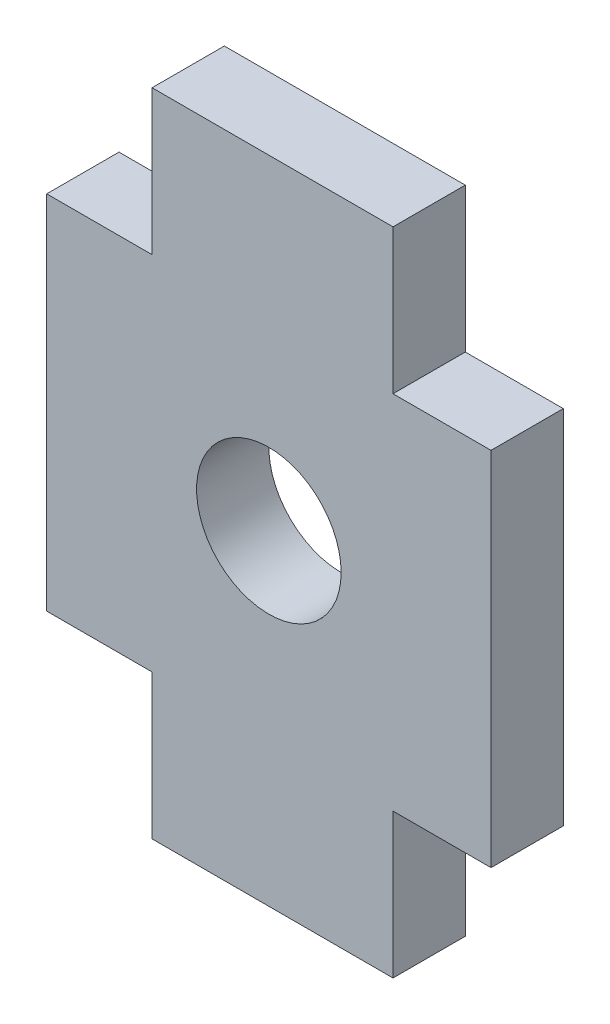
ISO-10303-21;
HEADER;
FILE_DESCRIPTION(('STEP AP214'),'2;1');
FILE_NAME('part.step','',(''),(''),'','','');
FILE_SCHEMA(('AUTOMOTIVE_DESIGN { 1 0 10303 214 1 1 1 1 }'));
ENDSEC;
DATA;
#1=APPLICATION_CONTEXT('core data for automotive mechanical design processes');
#2=APPLICATION_PROTOCOL_DEFINITION('international standard','automotive_design',2000,#1);
#3=PRODUCT_CONTEXT('',#1,'mechanical');
#4=PRODUCT('Part','Part','',(#3));
#5=PRODUCT_RELATED_PRODUCT_CATEGORY('part','',(#4));
#6=PRODUCT_DEFINITION_FORMATION('','',#4);
#7=PRODUCT_DEFINITION_CONTEXT('part definition',#1,'design');
#8=PRODUCT_DEFINITION('design','',#6,#7);
#9=PRODUCT_DEFINITION_SHAPE('','',#8);
#10=(LENGTH_UNIT() NAMED_UNIT(*) SI_UNIT(.MILLI.,.METRE.));
#11=(NAMED_UNIT(*) PLANE_ANGLE_UNIT() SI_UNIT($,.RADIAN.));
#12=(NAMED_UNIT(*) SI_UNIT($,.STERADIAN.) SOLID_ANGLE_UNIT());
#13=UNCERTAINTY_MEASURE_WITH_UNIT(LENGTH_MEASURE(1.E-05),#10,'distance_accuracy_value','');
#14=(GEOMETRIC_REPRESENTATION_CONTEXT(3) GLOBAL_UNCERTAINTY_ASSIGNED_CONTEXT((#13)) GLOBAL_UNIT_ASSIGNED_CONTEXT((#10,
#11,#12)) REPRESENTATION_CONTEXT('',''));
#15=CARTESIAN_POINT('',(0.,0.,0.));
#16=DIRECTION('',(0.,0.,1.));
#17=DIRECTION('',(1.,0.,0.));
#18=AXIS2_PLACEMENT_3D('',#15,#16,#17);
#19=CARTESIAN_POINT('',(0.,0.,6.));
#20=DIRECTION('',(0.,0.,-1.));
#21=DIRECTION('',(-1.,0.,0.));
#22=AXIS2_PLACEMENT_3D('',#19,#20,#21);
#23=PLANE('',#22);
#24=DIRECTION('',(0.,1.,0.));
#25=VECTOR('',#24,1.);
#26=CARTESIAN_POINT('',(-182.683627049338,-111.762954902338,6.));
#27=LINE('',#26,#25);
#28=CARTESIAN_POINT('',(-182.683627049338,-117.762954902338,6.));
#29=VERTEX_POINT('',#28);
#30=CARTESIAN_POINT('',(-182.683627049338,-105.762954902338,6.));
#31=VERTEX_POINT('',#30);
#32=EDGE_CURVE('E57',#29,#31,#27,.T.);
#33=ORIENTED_EDGE('',*,*,#32,.T.);
#34=DIRECTION('',(1.,0.,0.));
#35=VECTOR('',#34,1.);
#36=CARTESIAN_POINT('',(-182.683627049338,-105.762954902338,6.));
#37=LINE('',#36,#35);
#38=CARTESIAN_POINT('',(-174.549373807979,-105.762954902338,6.));
#39=VERTEX_POINT('',#38);
#40=EDGE_CURVE('E112',#31,#39,#37,.T.);
#41=ORIENTED_EDGE('',*,*,#40,.T.);
#42=DIRECTION('',(0.,1.,0.));
#43=VECTOR('',#42,1.);
#44=CARTESIAN_POINT('',(-174.549373807979,-75.7629549023382,6.));
#45=LINE('',#44,#43);
#46=CARTESIAN_POINT('',(-174.549373807979,-75.7629549023382,6.));
#47=VERTEX_POINT('',#46);
#48=EDGE_CURVE('E241',#39,#47,#45,.T.);
#49=ORIENTED_EDGE('',*,*,#48,.T.);
#50=DIRECTION('',(-1.,0.,0.));
#51=VECTOR('',#50,1.);
#52=CARTESIAN_POINT('',(-182.683627049338,-75.7629549023382,6.));
#53=LINE('',#52,#51);
#54=CARTESIAN_POINT('',(-182.683627049338,-75.7629549023382,6.));
#55=VERTEX_POINT('',#54);
#56=EDGE_CURVE('E261',#47,#55,#53,.T.);
#57=ORIENTED_EDGE('',*,*,#56,.T.);
#58=DIRECTION('',(0.,1.,0.));
#59=VECTOR('',#58,1.);
#60=CARTESIAN_POINT('',(-182.683627049338,-69.7629549023382,6.));
#61=LINE('',#60,#59);
#62=CARTESIAN_POINT('',(-182.683627049338,-63.7629549023382,6.));
#63=VERTEX_POINT('',#62);
#64=EDGE_CURVE('E257',#55,#63,#61,.T.);
#65=ORIENTED_EDGE('',*,*,#64,.T.);
#66=DIRECTION('',(-1.,0.,0.));
#67=VECTOR('',#66,1.);
#68=CARTESIAN_POINT('',(-202.683627049338,-63.7629549023382,6.));
#69=LINE('',#68,#67);
#70=CARTESIAN_POINT('',(-202.683627049338,-63.7629549023382,6.));
#71=VERTEX_POINT('',#70);
#72=EDGE_CURVE('E260',#63,#71,#69,.T.);
#73=ORIENTED_EDGE('',*,*,#72,.T.);
#74=DIRECTION('',(0.,-1.,0.));
#75=VECTOR('',#74,1.);
#76=CARTESIAN_POINT('',(-202.683627049338,-69.7629549023382,6.));
#77=LINE('',#76,#75);
#78=CARTESIAN_POINT('',(-202.683627049338,-75.7629549023382,6.));
#79=VERTEX_POINT('',#78);
#80=EDGE_CURVE('E265',#71,#79,#77,.T.);
#81=ORIENTED_EDGE('',*,*,#80,.T.);
#82=DIRECTION('',(-1.,0.,0.));
#83=VECTOR('',#82,1.);
#84=CARTESIAN_POINT('',(-211.428617247897,-75.7629549023382,6.));
#85=LINE('',#84,#83);
#86=CARTESIAN_POINT('',(-211.428617247897,-75.7629549023382,6.));
#87=VERTEX_POINT('',#86);
#88=EDGE_CURVE('E272',#79,#87,#85,.T.);
#89=ORIENTED_EDGE('',*,*,#88,.T.);
#90=DIRECTION('',(0.,-1.,0.));
#91=VECTOR('',#90,1.);
#92=CARTESIAN_POINT('',(-211.428617247897,-75.7629549023382,6.));
#93=LINE('',#92,#91);
#94=CARTESIAN_POINT('',(-211.428617247897,-105.762954902338,6.));
#95=VERTEX_POINT('',#94);
#96=EDGE_CURVE('E144',#87,#95,#93,.T.);
#97=ORIENTED_EDGE('',*,*,#96,.T.);
#98=DIRECTION('',(1.,0.,0.));
#99=VECTOR('',#98,1.);
#100=CARTESIAN_POINT('',(-211.428617247897,-105.762954902338,6.));
#101=LINE('',#100,#99);
#102=CARTESIAN_POINT('',(-202.683627049338,-105.762954902338,6.));
#103=VERTEX_POINT('',#102);
#104=EDGE_CURVE('E138',#95,#103,#101,.T.);
#105=ORIENTED_EDGE('',*,*,#104,.T.);
#106=DIRECTION('',(0.,-1.,0.));
#107=VECTOR('',#106,1.);
#108=CARTESIAN_POINT('',(-202.683627049338,-111.762954902338,6.));
#109=LINE('',#108,#107);
#110=CARTESIAN_POINT('',(-202.683627049338,-117.762954902338,6.));
#111=VERTEX_POINT('',#110);
#112=EDGE_CURVE('E142',#103,#111,#109,.T.);
#113=ORIENTED_EDGE('',*,*,#112,.T.);
#114=DIRECTION('',(1.,0.,0.));
#115=VECTOR('',#114,1.);
#116=CARTESIAN_POINT('',(-202.683627049338,-117.762954902338,6.));
#117=LINE('',#116,#115);
#118=EDGE_CURVE('E162',#111,#29,#117,.T.);
#119=ORIENTED_EDGE('',*,*,#118,.T.);
#120=EDGE_LOOP('',(#33,#41,#49,#57,#65,#73,#81,#89,#97,#105,#113,#119));
#121=FACE_BOUND('',#120,.T.);
#122=CARTESIAN_POINT('',(-192.988995527938,-90.7629549023382,6.));
#123=DIRECTION('',(0.,0.,1.));
#124=DIRECTION('',(1.,0.,0.));
#125=AXIS2_PLACEMENT_3D('',#122,#123,#124);
#126=CIRCLE('',#125,6.00000000000002);
#127=CARTESIAN_POINT('',(-186.988995527938,-90.7629549023382,6.));
#128=VERTEX_POINT('',#127);
#129=EDGE_CURVE('E173',#128,#128,#126,.T.);
#130=ORIENTED_EDGE('',*,*,#129,.F.);
#131=EDGE_LOOP('',(#130));
#132=FACE_BOUND('',#131,.T.);
#133=ADVANCED_FACE('F39',(#121,#132),#23,.F.);
#134=CARTESIAN_POINT('',(0.,0.,0.));
#135=DIRECTION('',(0.,0.,-1.));
#136=DIRECTION('',(-1.,0.,0.));
#137=AXIS2_PLACEMENT_3D('',#134,#135,#136);
#138=PLANE('',#137);
#139=DIRECTION('',(1.,0.,0.));
#140=VECTOR('',#139,1.);
#141=CARTESIAN_POINT('',(-182.683627049338,-105.762954902338,0.));
#142=LINE('',#141,#140);
#143=CARTESIAN_POINT('',(-182.683627049338,-105.762954902338,0.));
#144=VERTEX_POINT('',#143);
#145=CARTESIAN_POINT('',(-174.549373807979,-105.762954902338,0.));
#146=VERTEX_POINT('',#145);
#147=EDGE_CURVE('E169',#144,#146,#142,.T.);
#148=ORIENTED_EDGE('',*,*,#147,.F.);
#149=DIRECTION('',(0.,1.,0.));
#150=VECTOR('',#149,1.);
#151=CARTESIAN_POINT('',(-182.683627049338,-111.762954902338,0.));
#152=LINE('',#151,#150);
#153=CARTESIAN_POINT('',(-182.683627049338,-117.762954902338,0.));
#154=VERTEX_POINT('',#153);
#155=EDGE_CURVE('E202',#154,#144,#152,.T.);
#156=ORIENTED_EDGE('',*,*,#155,.F.);
#157=DIRECTION('',(1.,0.,0.));
#158=VECTOR('',#157,1.);
#159=CARTESIAN_POINT('',(-202.683627049338,-117.762954902338,0.));
#160=LINE('',#159,#158);
#161=CARTESIAN_POINT('',(-202.683627049338,-117.762954902338,0.));
#162=VERTEX_POINT('',#161);
#163=EDGE_CURVE('E105',#162,#154,#160,.T.);
#164=ORIENTED_EDGE('',*,*,#163,.F.);
#165=DIRECTION('',(0.,-1.,0.));
#166=VECTOR('',#165,1.);
#167=CARTESIAN_POINT('',(-202.683627049338,-111.762954902338,0.));
#168=LINE('',#167,#166);
#169=CARTESIAN_POINT('',(-202.683627049338,-105.762954902338,0.));
#170=VERTEX_POINT('',#169);
#171=EDGE_CURVE('E98',#170,#162,#168,.T.);
#172=ORIENTED_EDGE('',*,*,#171,.F.);
#173=DIRECTION('',(1.,0.,0.));
#174=VECTOR('',#173,1.);
#175=CARTESIAN_POINT('',(-211.428617247897,-105.762954902338,0.));
#176=LINE('',#175,#174);
#177=CARTESIAN_POINT('',(-211.428617247897,-105.762954902338,0.));
#178=VERTEX_POINT('',#177);
#179=EDGE_CURVE('E154',#178,#170,#176,.T.);
#180=ORIENTED_EDGE('',*,*,#179,.F.);
#181=DIRECTION('',(0.,-1.,0.));
#182=VECTOR('',#181,1.);
#183=CARTESIAN_POINT('',(-211.428617247897,-75.7629549023382,0.));
#184=LINE('',#183,#182);
#185=CARTESIAN_POINT('',(-211.428617247897,-75.7629549023382,0.));
#186=VERTEX_POINT('',#185);
#187=EDGE_CURVE('E193',#186,#178,#184,.T.);
#188=ORIENTED_EDGE('',*,*,#187,.F.);
#189=DIRECTION('',(-1.,0.,0.));
#190=VECTOR('',#189,1.);
#191=CARTESIAN_POINT('',(-211.428617247897,-75.7629549023382,0.));
#192=LINE('',#191,#190);
#193=CARTESIAN_POINT('',(-202.683627049338,-75.7629549023382,0.));
#194=VERTEX_POINT('',#193);
#195=EDGE_CURVE('E190',#194,#186,#192,.T.);
#196=ORIENTED_EDGE('',*,*,#195,.F.);
#197=DIRECTION('',(0.,-1.,0.));
#198=VECTOR('',#197,1.);
#199=CARTESIAN_POINT('',(-202.683627049338,-69.7629549023382,0.));
#200=LINE('',#199,#198);
#201=CARTESIAN_POINT('',(-202.683627049338,-63.7629549023382,0.));
#202=VERTEX_POINT('',#201);
#203=EDGE_CURVE('E187',#202,#194,#200,.T.);
#204=ORIENTED_EDGE('',*,*,#203,.F.);
#205=DIRECTION('',(-1.,0.,0.));
#206=VECTOR('',#205,1.);
#207=CARTESIAN_POINT('',(-202.683627049338,-63.7629549023382,0.));
#208=LINE('',#207,#206);
#209=CARTESIAN_POINT('',(-182.683627049338,-63.7629549023382,0.));
#210=VERTEX_POINT('',#209);
#211=EDGE_CURVE('E183',#210,#202,#208,.T.);
#212=ORIENTED_EDGE('',*,*,#211,.F.);
#213=DIRECTION('',(0.,1.,0.));
#214=VECTOR('',#213,1.);
#215=CARTESIAN_POINT('',(-182.683627049338,-69.7629549023382,0.));
#216=LINE('',#215,#214);
#217=CARTESIAN_POINT('',(-182.683627049338,-75.7629549023382,0.));
#218=VERTEX_POINT('',#217);
#219=EDGE_CURVE('E180',#218,#210,#216,.T.);
#220=ORIENTED_EDGE('',*,*,#219,.F.);
#221=DIRECTION('',(-1.,0.,0.));
#222=VECTOR('',#221,1.);
#223=CARTESIAN_POINT('',(-182.683627049338,-75.7629549023382,0.));
#224=LINE('',#223,#222);
#225=CARTESIAN_POINT('',(-174.549373807979,-75.7629549023382,0.));
#226=VERTEX_POINT('',#225);
#227=EDGE_CURVE('E176',#226,#218,#224,.T.);
#228=ORIENTED_EDGE('',*,*,#227,.F.);
#229=DIRECTION('',(0.,1.,0.));
#230=VECTOR('',#229,1.);
#231=CARTESIAN_POINT('',(-174.549373807979,-75.7629549023382,0.));
#232=LINE('',#231,#230);
#233=EDGE_CURVE('E172',#146,#226,#232,.T.);
#234=ORIENTED_EDGE('',*,*,#233,.F.);
#235=EDGE_LOOP('',(#148,#156,#164,#172,#180,#188,#196,#204,#212,#220,#228,#234));
#236=FACE_BOUND('',#235,.T.);
#237=CARTESIAN_POINT('',(-192.988995527938,-90.7629549023382,0.));
#238=DIRECTION('',(0.,0.,1.));
#239=DIRECTION('',(1.,0.,0.));
#240=AXIS2_PLACEMENT_3D('',#237,#238,#239);
#241=CIRCLE('',#240,6.00000000000002);
#242=CARTESIAN_POINT('',(-186.988995527938,-90.7629549023382,0.));
#243=VERTEX_POINT('',#242);
#244=EDGE_CURVE('E292',#243,#243,#241,.T.);
#245=ORIENTED_EDGE('',*,*,#244,.T.);
#246=EDGE_LOOP('',(#245));
#247=FACE_BOUND('',#246,.T.);
#248=ADVANCED_FACE('F245',(#236,#247),#138,.T.);
#249=CARTESIAN_POINT('',(-182.683627049338,-105.762954902338,6.));
#250=DIRECTION('',(0.,1.,0.));
#251=DIRECTION('',(0.,0.,1.));
#252=AXIS2_PLACEMENT_3D('',#249,#250,#251);
#253=PLANE('',#252);
#254=ORIENTED_EDGE('',*,*,#147,.T.);
#255=DIRECTION('',(0.,0.,-1.));
#256=VECTOR('',#255,1.);
#257=CARTESIAN_POINT('',(-174.549373807979,-105.762954902338,6.));
#258=LINE('',#257,#256);
#259=EDGE_CURVE('E49',#39,#146,#258,.T.);
#260=ORIENTED_EDGE('',*,*,#259,.F.);
#261=ORIENTED_EDGE('',*,*,#40,.F.);
#262=DIRECTION('',(0.,0.,-1.));
#263=VECTOR('',#262,1.);
#264=CARTESIAN_POINT('',(-182.683627049338,-105.762954902338,6.));
#265=LINE('',#264,#263);
#266=EDGE_CURVE('E11',#31,#144,#265,.T.);
#267=ORIENTED_EDGE('',*,*,#266,.T.);
#268=EDGE_LOOP('',(#254,#260,#261,#267));
#269=FACE_BOUND('',#268,.T.);
#270=ADVANCED_FACE('F41',(#269),#253,.F.);
#271=CARTESIAN_POINT('',(-174.549373807979,-75.7629549023382,6.));
#272=DIRECTION('',(-1.,0.,0.));
#273=DIRECTION('',(0.,0.,1.));
#274=AXIS2_PLACEMENT_3D('',#271,#272,#273);
#275=PLANE('',#274);
#276=ORIENTED_EDGE('',*,*,#233,.T.);
#277=DIRECTION('',(0.,0.,-1.));
#278=VECTOR('',#277,1.);
#279=CARTESIAN_POINT('',(-174.549373807979,-75.7629549023382,6.));
#280=LINE('',#279,#278);
#281=EDGE_CURVE('E231',#47,#226,#280,.T.);
#282=ORIENTED_EDGE('',*,*,#281,.F.);
#283=ORIENTED_EDGE('',*,*,#48,.F.);
#284=ORIENTED_EDGE('',*,*,#259,.T.);
#285=EDGE_LOOP('',(#276,#282,#283,#284));
#286=FACE_BOUND('',#285,.T.);
#287=ADVANCED_FACE('F239',(#286),#275,.F.);
#288=CARTESIAN_POINT('',(-182.683627049338,-75.7629549023382,6.));
#289=DIRECTION('',(0.,-1.,0.));
#290=DIRECTION('',(0.,0.,-1.));
#291=AXIS2_PLACEMENT_3D('',#288,#289,#290);
#292=PLANE('',#291);
#293=ORIENTED_EDGE('',*,*,#227,.T.);
#294=DIRECTION('',(0.,0.,-1.));
#295=VECTOR('',#294,1.);
#296=CARTESIAN_POINT('',(-182.683627049338,-75.7629549023382,6.));
#297=LINE('',#296,#295);
#298=EDGE_CURVE('E227',#55,#218,#297,.T.);
#299=ORIENTED_EDGE('',*,*,#298,.F.);
#300=ORIENTED_EDGE('',*,*,#56,.F.);
#301=ORIENTED_EDGE('',*,*,#281,.T.);
#302=EDGE_LOOP('',(#293,#299,#300,#301));
#303=FACE_BOUND('',#302,.T.);
#304=ADVANCED_FACE('F251',(#303),#292,.F.);
#305=CARTESIAN_POINT('',(-182.683627049338,-69.7629549023382,6.));
#306=DIRECTION('',(-1.,0.,0.));
#307=DIRECTION('',(0.,0.,1.));
#308=AXIS2_PLACEMENT_3D('',#305,#306,#307);
#309=PLANE('',#308);
#310=ORIENTED_EDGE('',*,*,#219,.T.);
#311=DIRECTION('',(0.,0.,-1.));
#312=VECTOR('',#311,1.);
#313=CARTESIAN_POINT('',(-182.683627049338,-63.7629549023382,6.));
#314=LINE('',#313,#312);
#315=EDGE_CURVE('E223',#63,#210,#314,.T.);
#316=ORIENTED_EDGE('',*,*,#315,.F.);
#317=ORIENTED_EDGE('',*,*,#64,.F.);
#318=ORIENTED_EDGE('',*,*,#298,.T.);
#319=EDGE_LOOP('',(#310,#316,#317,#318));
#320=FACE_BOUND('',#319,.T.);
#321=ADVANCED_FACE('F255',(#320),#309,.F.);
#322=CARTESIAN_POINT('',(-202.683627049338,-63.7629549023382,6.));
#323=DIRECTION('',(0.,-1.,0.));
#324=DIRECTION('',(0.,0.,-1.));
#325=AXIS2_PLACEMENT_3D('',#322,#323,#324);
#326=PLANE('',#325);
#327=ORIENTED_EDGE('',*,*,#211,.T.);
#328=DIRECTION('',(0.,0.,-1.));
#329=VECTOR('',#328,1.);
#330=CARTESIAN_POINT('',(-202.683627049338,-63.7629549023382,6.));
#331=LINE('',#330,#329);
#332=EDGE_CURVE('E219',#71,#202,#331,.T.);
#333=ORIENTED_EDGE('',*,*,#332,.F.);
#334=ORIENTED_EDGE('',*,*,#72,.F.);
#335=ORIENTED_EDGE('',*,*,#315,.T.);
#336=EDGE_LOOP('',(#327,#333,#334,#335));
#337=FACE_BOUND('',#336,.T.);
#338=ADVANCED_FACE('F326',(#337),#326,.F.);
#339=CARTESIAN_POINT('',(-202.683627049338,-69.7629549023382,6.));
#340=DIRECTION('',(1.,0.,0.));
#341=DIRECTION('',(0.,0.,-1.));
#342=AXIS2_PLACEMENT_3D('',#339,#340,#341);
#343=PLANE('',#342);
#344=ORIENTED_EDGE('',*,*,#203,.T.);
#345=DIRECTION('',(0.,0.,-1.));
#346=VECTOR('',#345,1.);
#347=CARTESIAN_POINT('',(-202.683627049338,-75.7629549023382,6.));
#348=LINE('',#347,#346);
#349=EDGE_CURVE('E215',#79,#194,#348,.T.);
#350=ORIENTED_EDGE('',*,*,#349,.F.);
#351=ORIENTED_EDGE('',*,*,#80,.F.);
#352=ORIENTED_EDGE('',*,*,#332,.T.);
#353=EDGE_LOOP('',(#344,#350,#351,#352));
#354=FACE_BOUND('',#353,.T.);
#355=ADVANCED_FACE('F323',(#354),#343,.F.);
#356=CARTESIAN_POINT('',(-211.428617247897,-75.7629549023382,6.));
#357=DIRECTION('',(0.,-1.,0.));
#358=DIRECTION('',(0.,0.,-1.));
#359=AXIS2_PLACEMENT_3D('',#356,#357,#358);
#360=PLANE('',#359);
#361=ORIENTED_EDGE('',*,*,#195,.T.);
#362=DIRECTION('',(0.,0.,-1.));
#363=VECTOR('',#362,1.);
#364=CARTESIAN_POINT('',(-211.428617247897,-75.7629549023382,6.));
#365=LINE('',#364,#363);
#366=EDGE_CURVE('E211',#87,#186,#365,.T.);
#367=ORIENTED_EDGE('',*,*,#366,.F.);
#368=ORIENTED_EDGE('',*,*,#88,.F.);
#369=ORIENTED_EDGE('',*,*,#349,.T.);
#370=EDGE_LOOP('',(#361,#367,#368,#369));
#371=FACE_BOUND('',#370,.T.);
#372=ADVANCED_FACE('F280',(#371),#360,.F.);
#373=CARTESIAN_POINT('',(-211.428617247897,-75.7629549023382,6.));
#374=DIRECTION('',(1.,0.,0.));
#375=DIRECTION('',(0.,0.,-1.));
#376=AXIS2_PLACEMENT_3D('',#373,#374,#375);
#377=PLANE('',#376);
#378=ORIENTED_EDGE('',*,*,#187,.T.);
#379=DIRECTION('',(0.,0.,-1.));
#380=VECTOR('',#379,1.);
#381=CARTESIAN_POINT('',(-211.428617247897,-105.762954902338,6.));
#382=LINE('',#381,#380);
#383=EDGE_CURVE('E156',#95,#178,#382,.T.);
#384=ORIENTED_EDGE('',*,*,#383,.F.);
#385=ORIENTED_EDGE('',*,*,#96,.F.);
#386=ORIENTED_EDGE('',*,*,#366,.T.);
#387=EDGE_LOOP('',(#378,#384,#385,#386));
#388=FACE_BOUND('',#387,.T.);
#389=ADVANCED_FACE('F284',(#388),#377,.F.);
#390=CARTESIAN_POINT('',(-211.428617247897,-105.762954902338,6.));
#391=DIRECTION('',(0.,1.,0.));
#392=DIRECTION('',(0.,0.,1.));
#393=AXIS2_PLACEMENT_3D('',#390,#391,#392);
#394=PLANE('',#393);
#395=ORIENTED_EDGE('',*,*,#179,.T.);
#396=DIRECTION('',(0.,0.,-1.));
#397=VECTOR('',#396,1.);
#398=CARTESIAN_POINT('',(-202.683627049338,-105.762954902338,6.));
#399=LINE('',#398,#397);
#400=EDGE_CURVE('E151',#103,#170,#399,.T.);
#401=ORIENTED_EDGE('',*,*,#400,.F.);
#402=ORIENTED_EDGE('',*,*,#104,.F.);
#403=ORIENTED_EDGE('',*,*,#383,.T.);
#404=EDGE_LOOP('',(#395,#401,#402,#403));
#405=FACE_BOUND('',#404,.T.);
#406=ADVANCED_FACE('F152',(#405),#394,.F.);
#407=CARTESIAN_POINT('',(-202.683627049338,-111.762954902338,6.));
#408=DIRECTION('',(1.,0.,0.));
#409=DIRECTION('',(0.,0.,-1.));
#410=AXIS2_PLACEMENT_3D('',#407,#408,#409);
#411=PLANE('',#410);
#412=ORIENTED_EDGE('',*,*,#171,.T.);
#413=DIRECTION('',(0.,0.,-1.));
#414=VECTOR('',#413,1.);
#415=CARTESIAN_POINT('',(-202.683627049338,-117.762954902338,6.));
#416=LINE('',#415,#414);
#417=EDGE_CURVE('E157',#111,#162,#416,.T.);
#418=ORIENTED_EDGE('',*,*,#417,.F.);
#419=ORIENTED_EDGE('',*,*,#112,.F.);
#420=ORIENTED_EDGE('',*,*,#400,.T.);
#421=EDGE_LOOP('',(#412,#418,#419,#420));
#422=FACE_BOUND('',#421,.T.);
#423=ADVANCED_FACE('F159',(#422),#411,.F.);
#424=CARTESIAN_POINT('',(-202.683627049338,-117.762954902338,6.));
#425=DIRECTION('',(0.,1.,0.));
#426=DIRECTION('',(0.,0.,1.));
#427=AXIS2_PLACEMENT_3D('',#424,#425,#426);
#428=PLANE('',#427);
#429=ORIENTED_EDGE('',*,*,#163,.T.);
#430=DIRECTION('',(0.,0.,-1.));
#431=VECTOR('',#430,1.);
#432=CARTESIAN_POINT('',(-182.683627049338,-117.762954902338,6.));
#433=LINE('',#432,#431);
#434=EDGE_CURVE('E165',#29,#154,#433,.T.);
#435=ORIENTED_EDGE('',*,*,#434,.F.);
#436=ORIENTED_EDGE('',*,*,#118,.F.);
#437=ORIENTED_EDGE('',*,*,#417,.T.);
#438=EDGE_LOOP('',(#429,#435,#436,#437));
#439=FACE_BOUND('',#438,.T.);
#440=ADVANCED_FACE('F286',(#439),#428,.F.);
#441=CARTESIAN_POINT('',(-182.683627049338,-111.762954902338,6.));
#442=DIRECTION('',(-1.,0.,0.));
#443=DIRECTION('',(0.,0.,1.));
#444=AXIS2_PLACEMENT_3D('',#441,#442,#443);
#445=PLANE('',#444);
#446=ORIENTED_EDGE('',*,*,#155,.T.);
#447=ORIENTED_EDGE('',*,*,#266,.F.);
#448=ORIENTED_EDGE('',*,*,#32,.F.);
#449=ORIENTED_EDGE('',*,*,#434,.T.);
#450=EDGE_LOOP('',(#446,#447,#448,#449));
#451=FACE_BOUND('',#450,.T.);
#452=ADVANCED_FACE('F285',(#451),#445,.F.);
#453=CARTESIAN_POINT('',(-192.988995527938,-90.7629549023382,6.));
#454=DIRECTION('',(0.,0.,-1.));
#455=DIRECTION('',(-1.,0.,0.));
#456=AXIS2_PLACEMENT_3D('',#453,#454,#455);
#457=CYLINDRICAL_SURFACE('',#456,6.00000000000002);
#458=ORIENTED_EDGE('',*,*,#129,.T.);
#459=EDGE_LOOP('',(#458));
#460=FACE_BOUND('',#459,.T.);
#461=ORIENTED_EDGE('',*,*,#244,.F.);
#462=EDGE_LOOP('',(#461));
#463=FACE_BOUND('',#462,.T.);
#464=ADVANCED_FACE('F301',(#460,#463),#457,.F.);
#465=CLOSED_SHELL('',(#133,#248,#270,#287,#304,#321,#338,#355,#372,#389,#406,#423,#440,#452,#464));
#466=MANIFOLD_SOLID_BREP('B2',#465);
#467=ADVANCED_BREP_SHAPE_REPRESENTATION('',(#18,#466),#14);
#468=SHAPE_DEFINITION_REPRESENTATION(#9,#467);
ENDSEC;
END-ISO-10303-21;
